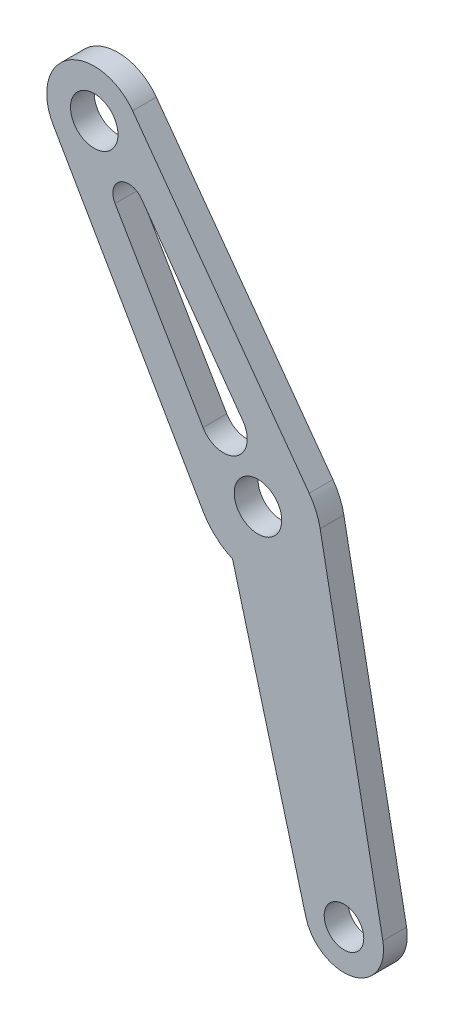
ISO-10303-21;
HEADER;
FILE_DESCRIPTION(('STEP AP214'),'2;1');
FILE_NAME('part.step','',(''),(''),'','','');
FILE_SCHEMA(('AUTOMOTIVE_DESIGN { 1 0 10303 214 1 1 1 1 }'));
ENDSEC;
DATA;
#1=APPLICATION_CONTEXT('core data for automotive mechanical design processes');
#2=APPLICATION_PROTOCOL_DEFINITION('international standard','automotive_design',2000,#1);
#3=PRODUCT_CONTEXT('',#1,'mechanical');
#4=PRODUCT('Part','Part','',(#3));
#5=PRODUCT_RELATED_PRODUCT_CATEGORY('part','',(#4));
#6=PRODUCT_DEFINITION_FORMATION('','',#4);
#7=PRODUCT_DEFINITION_CONTEXT('part definition',#1,'design');
#8=PRODUCT_DEFINITION('design','',#6,#7);
#9=PRODUCT_DEFINITION_SHAPE('','',#8);
#10=(LENGTH_UNIT() NAMED_UNIT(*) SI_UNIT(.MILLI.,.METRE.));
#11=(NAMED_UNIT(*) PLANE_ANGLE_UNIT() SI_UNIT($,.RADIAN.));
#12=(NAMED_UNIT(*) SI_UNIT($,.STERADIAN.) SOLID_ANGLE_UNIT());
#13=UNCERTAINTY_MEASURE_WITH_UNIT(LENGTH_MEASURE(1.E-05),#10,'distance_accuracy_value','');
#14=(GEOMETRIC_REPRESENTATION_CONTEXT(3) GLOBAL_UNCERTAINTY_ASSIGNED_CONTEXT((#13)) GLOBAL_UNIT_ASSIGNED_CONTEXT((#10,
#11,#12)) REPRESENTATION_CONTEXT('',''));
#15=CARTESIAN_POINT('',(0.,0.,0.));
#16=DIRECTION('',(0.,0.,1.));
#17=DIRECTION('',(1.,0.,0.));
#18=AXIS2_PLACEMENT_3D('',#15,#16,#17);
#19=CARTESIAN_POINT('',(-32.750399665372,31.391765860163,3.));
#20=DIRECTION('',(0.,0.,1.));
#21=DIRECTION('',(1.,0.,0.));
#22=AXIS2_PLACEMENT_3D('',#19,#20,#21);
#23=PLANE('',#22);
#24=CARTESIAN_POINT('',(-12.0541163348009,-0.477715721763063,3.));
#25=DIRECTION('',(0.,0.,1.));
#26=DIRECTION('',(1.,0.,0.));
#27=AXIS2_PLACEMENT_3D('',#24,#25,#26);
#28=CIRCLE('',#27,3.);
#29=CARTESIAN_POINT('',(-9.05411633480087,-0.477715721763063,3.));
#30=VERTEX_POINT('',#29);
#31=EDGE_CURVE('E164',#30,#30,#28,.T.);
#32=ORIENTED_EDGE('',*,*,#31,.F.);
#33=EDGE_LOOP('',(#32));
#34=FACE_BOUND('',#33,.T.);
#35=CARTESIAN_POINT('',(-32.750399665372,31.391765860163,3.));
#36=DIRECTION('',(0.,0.,1.));
#37=DIRECTION('',(1.,0.,0.));
#38=AXIS2_PLACEMENT_3D('',#35,#36,#37);
#39=CIRCLE('',#38,6.);
#40=CARTESIAN_POINT('',(-27.8973419266839,34.919914182578,3.));
#41=VERTEX_POINT('',#40);
#42=CARTESIAN_POINT('',(-37.9474399524906,28.3933042122399,3.));
#43=VERTEX_POINT('',#42);
#44=EDGE_CURVE('E176',#41,#43,#39,.T.);
#45=ORIENTED_EDGE('',*,*,#44,.T.);
#46=DIRECTION('',(0.499743607987195,-0.866173381186435,0.));
#47=VECTOR('',#46,1.);
#48=CARTESIAN_POINT('',(-37.9474399524906,28.3933042122399,3.));
#49=LINE('',#48,#47);
#50=CARTESIAN_POINT('',(-18.9835033842924,-4.47566458566063,3.));
#51=VERTEX_POINT('',#50);
#52=EDGE_CURVE('E179',#43,#51,#49,.T.);
#53=ORIENTED_EDGE('',*,*,#52,.T.);
#54=CARTESIAN_POINT('',(-12.0541163348009,-0.477715721763063,3.));
#55=DIRECTION('',(0.,0.,1.));
#56=DIRECTION('',(1.,0.,0.));
#57=AXIS2_PLACEMENT_3D('',#54,#55,#56);
#58=CIRCLE('',#57,8.00000000000001);
#59=CARTESIAN_POINT('',(-15.2674210476336,-7.80401579905222,3.));
#60=VERTEX_POINT('',#59);
#61=EDGE_CURVE('E182',#51,#60,#58,.T.);
#62=ORIENTED_EDGE('',*,*,#61,.T.);
#63=DIRECTION('',(0.258819045102522,-0.965925826289068,0.));
#64=VECTOR('',#63,1.);
#65=CARTESIAN_POINT('',(-15.2674210476336,-7.80401579905222,3.));
#66=LINE('',#65,#64);
#67=CARTESIAN_POINT('',(-6.0133455719403,-42.3406956514165,3.));
#68=VERTEX_POINT('',#67);
#69=EDGE_CURVE('E184',#60,#68,#66,.T.);
#70=ORIENTED_EDGE('',*,*,#69,.T.);
#71=CARTESIAN_POINT('',(-1.18371644049496,-41.0466004259039,3.));
#72=DIRECTION('',(0.,0.,1.));
#73=DIRECTION('',(1.,0.,0.));
#74=AXIS2_PLACEMENT_3D('',#71,#72,#73);
#75=CIRCLE('',#74,5.);
#76=CARTESIAN_POINT('',(3.72601182660465,-40.1007841946819,3.));
#77=VERTEX_POINT('',#76);
#78=EDGE_CURVE('E186',#68,#77,#75,.T.);
#79=ORIENTED_EDGE('',*,*,#78,.T.);
#80=DIRECTION('',(-0.1891632462444,0.981945653419923,0.));
#81=VECTOR('',#80,1.);
#82=CARTESIAN_POINT('',(3.72601182660466,-40.1007841946819,3.));
#83=LINE('',#82,#81);
#84=CARTESIAN_POINT('',(-4.19855110744148,1.03559024819214,3.));
#85=VERTEX_POINT('',#84);
#86=EDGE_CURVE('E188',#77,#85,#83,.T.);
#87=ORIENTED_EDGE('',*,*,#86,.T.);
#88=CARTESIAN_POINT('',(-12.0541163348009,-0.477715721763063,3.));
#89=DIRECTION('',(0.,0.,1.));
#90=DIRECTION('',(1.,0.,0.));
#91=AXIS2_PLACEMENT_3D('',#88,#89,#90);
#92=CIRCLE('',#91,8.);
#93=CARTESIAN_POINT('',(-5.58337268321678,4.22648204145696,3.));
#94=VERTEX_POINT('',#93);
#95=EDGE_CURVE('E190',#85,#94,#92,.T.);
#96=ORIENTED_EDGE('',*,*,#95,.T.);
#97=DIRECTION('',(-0.588024720402503,0.808842956448011,0.));
#98=VECTOR('',#97,1.);
#99=CARTESIAN_POINT('',(-27.8973419266839,34.919914182578,3.));
#100=LINE('',#99,#98);
#101=EDGE_CURVE('E192',#94,#41,#100,.T.);
#102=ORIENTED_EDGE('',*,*,#101,.T.);
#103=EDGE_LOOP('',(#45,#53,#62,#70,#79,#87,#96,#102));
#104=FACE_BOUND('',#103,.T.);
#105=CARTESIAN_POINT('',(-1.18371644049496,-41.0466004259039,3.));
#106=DIRECTION('',(0.,0.,1.));
#107=DIRECTION('',(1.,0.,0.));
#108=AXIS2_PLACEMENT_3D('',#105,#106,#107);
#109=CIRCLE('',#108,2.5);
#110=CARTESIAN_POINT('',(1.31628355950504,-41.0466004259039,3.));
#111=VERTEX_POINT('',#110);
#112=EDGE_CURVE('E170',#111,#111,#109,.T.);
#113=ORIENTED_EDGE('',*,*,#112,.F.);
#114=EDGE_LOOP('',(#113));
#115=FACE_BOUND('',#114,.T.);
#116=CARTESIAN_POINT('',(-32.750399665372,31.391765860163,3.));
#117=DIRECTION('',(0.,0.,1.));
#118=DIRECTION('',(1.,0.,0.));
#119=AXIS2_PLACEMENT_3D('',#116,#117,#118);
#120=CIRCLE('',#119,3.);
#121=CARTESIAN_POINT('',(-29.7503996653719,31.391765860163,3.));
#122=VERTEX_POINT('',#121);
#123=EDGE_CURVE('E158',#122,#122,#120,.T.);
#124=ORIENTED_EDGE('',*,*,#123,.F.);
#125=EDGE_LOOP('',(#124));
#126=FACE_BOUND('',#125,.T.);
#127=DIRECTION('',(0.505954711009421,-0.862560044522915,0.));
#128=VECTOR('',#127,1.);
#129=CARTESIAN_POINT('',(-30.1184074742976,23.6704918945808,3.));
#130=LINE('',#129,#128);
#131=CARTESIAN_POINT('',(-30.1184074742976,23.6704918945808,3.));
#132=VERTEX_POINT('',#131);
#133=CARTESIAN_POINT('',(-18.9989087484899,4.71378468877205,3.));
#134=VERTEX_POINT('',#133);
#135=EDGE_CURVE('E130',#132,#134,#130,.T.);
#136=ORIENTED_EDGE('',*,*,#135,.F.);
#137=CARTESIAN_POINT('',(-28.3932873852517,24.6824013165996,3.));
#138=DIRECTION('',(0.,0.,1.));
#139=DIRECTION('',(1.,0.,0.));
#140=AXIS2_PLACEMENT_3D('',#137,#138,#139);
#141=CIRCLE('',#140,2.);
#142=CARTESIAN_POINT('',(-26.7671925752995,25.8467962964267,3.));
#143=VERTEX_POINT('',#142);
#144=EDGE_CURVE('E122',#143,#132,#141,.T.);
#145=ORIENTED_EDGE('',*,*,#144,.F.);
#146=DIRECTION('',(-0.582197489913552,0.813047404976094,0.));
#147=VECTOR('',#146,1.);
#148=CARTESIAN_POINT('',(-26.7671925752995,25.8467962964267,3.));
#149=LINE('',#148,#147);
#150=CARTESIAN_POINT('',(-13.9720863999928,7.97824129154099,3.));
#151=VERTEX_POINT('',#150);
#152=EDGE_CURVE('E144',#151,#143,#149,.T.);
#153=ORIENTED_EDGE('',*,*,#152,.F.);
#154=CARTESIAN_POINT('',(-16.4112286149211,6.23164882180032,3.));
#155=DIRECTION('',(0.,0.,1.));
#156=DIRECTION('',(1.,0.,0.));
#157=AXIS2_PLACEMENT_3D('',#154,#155,#156);
#158=CIRCLE('',#157,3.00000000000001);
#159=EDGE_CURVE('E142',#134,#151,#158,.T.);
#160=ORIENTED_EDGE('',*,*,#159,.F.);
#161=EDGE_LOOP('',(#136,#145,#153,#160));
#162=FACE_BOUND('',#161,.T.);
#163=ADVANCED_FACE('F33',(#34,#104,#115,#126,#162),#23,.T.);
#164=CARTESIAN_POINT('',(-32.750399665372,31.391765860163,0.));
#165=DIRECTION('',(0.,0.,1.));
#166=DIRECTION('',(1.,0.,0.));
#167=AXIS2_PLACEMENT_3D('',#164,#165,#166);
#168=PLANE('',#167);
#169=CARTESIAN_POINT('',(-32.750399665372,31.391765860163,0.));
#170=DIRECTION('',(0.,0.,1.));
#171=DIRECTION('',(1.,0.,0.));
#172=AXIS2_PLACEMENT_3D('',#169,#170,#171);
#173=CIRCLE('',#172,3.);
#174=CARTESIAN_POINT('',(-29.7503996653719,31.391765860163,0.));
#175=VERTEX_POINT('',#174);
#176=EDGE_CURVE('E138',#175,#175,#173,.T.);
#177=ORIENTED_EDGE('',*,*,#176,.T.);
#178=EDGE_LOOP('',(#177));
#179=FACE_BOUND('',#178,.T.);
#180=CARTESIAN_POINT('',(-12.0541163348009,-0.477715721763063,0.));
#181=DIRECTION('',(0.,0.,1.));
#182=DIRECTION('',(1.,0.,0.));
#183=AXIS2_PLACEMENT_3D('',#180,#181,#182);
#184=CIRCLE('',#183,3.);
#185=CARTESIAN_POINT('',(-9.05411633480087,-0.477715721763063,0.));
#186=VERTEX_POINT('',#185);
#187=EDGE_CURVE('E161',#186,#186,#184,.T.);
#188=ORIENTED_EDGE('',*,*,#187,.T.);
#189=EDGE_LOOP('',(#188));
#190=FACE_BOUND('',#189,.T.);
#191=CARTESIAN_POINT('',(-1.18371644049496,-41.0466004259039,0.));
#192=DIRECTION('',(0.,0.,1.));
#193=DIRECTION('',(1.,0.,0.));
#194=AXIS2_PLACEMENT_3D('',#191,#192,#193);
#195=CIRCLE('',#194,2.5);
#196=CARTESIAN_POINT('',(1.31628355950504,-41.0466004259039,0.));
#197=VERTEX_POINT('',#196);
#198=EDGE_CURVE('E167',#197,#197,#195,.T.);
#199=ORIENTED_EDGE('',*,*,#198,.T.);
#200=EDGE_LOOP('',(#199));
#201=FACE_BOUND('',#200,.T.);
#202=CARTESIAN_POINT('',(-32.750399665372,31.391765860163,0.));
#203=DIRECTION('',(0.,0.,1.));
#204=DIRECTION('',(1.,0.,0.));
#205=AXIS2_PLACEMENT_3D('',#202,#203,#204);
#206=CIRCLE('',#205,6.);
#207=CARTESIAN_POINT('',(-27.8973419266839,34.919914182578,0.));
#208=VERTEX_POINT('',#207);
#209=CARTESIAN_POINT('',(-37.9474399524906,28.3933042122399,0.));
#210=VERTEX_POINT('',#209);
#211=EDGE_CURVE('E173',#208,#210,#206,.T.);
#212=ORIENTED_EDGE('',*,*,#211,.F.);
#213=DIRECTION('',(-0.588024720402503,0.808842956448011,0.));
#214=VECTOR('',#213,1.);
#215=CARTESIAN_POINT('',(-27.8973419266839,34.919914182578,0.));
#216=LINE('',#215,#214);
#217=CARTESIAN_POINT('',(-5.58337268321678,4.22648204145696,0.));
#218=VERTEX_POINT('',#217);
#219=EDGE_CURVE('E180',#218,#208,#216,.T.);
#220=ORIENTED_EDGE('',*,*,#219,.F.);
#221=CARTESIAN_POINT('',(-12.0541163348009,-0.477715721763063,0.));
#222=DIRECTION('',(0.,0.,1.));
#223=DIRECTION('',(1.,0.,0.));
#224=AXIS2_PLACEMENT_3D('',#221,#222,#223);
#225=CIRCLE('',#224,8.);
#226=CARTESIAN_POINT('',(-4.19855110744148,1.03559024819214,0.));
#227=VERTEX_POINT('',#226);
#228=EDGE_CURVE('E207',#227,#218,#225,.T.);
#229=ORIENTED_EDGE('',*,*,#228,.F.);
#230=DIRECTION('',(-0.1891632462444,0.981945653419923,0.));
#231=VECTOR('',#230,1.);
#232=CARTESIAN_POINT('',(3.72601182660466,-40.1007841946819,0.));
#233=LINE('',#232,#231);
#234=CARTESIAN_POINT('',(3.72601182660465,-40.1007841946819,0.));
#235=VERTEX_POINT('',#234);
#236=EDGE_CURVE('E205',#235,#227,#233,.T.);
#237=ORIENTED_EDGE('',*,*,#236,.F.);
#238=CARTESIAN_POINT('',(-1.18371644049496,-41.0466004259039,0.));
#239=DIRECTION('',(0.,0.,1.));
#240=DIRECTION('',(1.,0.,0.));
#241=AXIS2_PLACEMENT_3D('',#238,#239,#240);
#242=CIRCLE('',#241,5.);
#243=CARTESIAN_POINT('',(-6.0133455719403,-42.3406956514165,0.));
#244=VERTEX_POINT('',#243);
#245=EDGE_CURVE('E203',#244,#235,#242,.T.);
#246=ORIENTED_EDGE('',*,*,#245,.F.);
#247=DIRECTION('',(0.258819045102522,-0.965925826289068,0.));
#248=VECTOR('',#247,1.);
#249=CARTESIAN_POINT('',(-15.2674210476336,-7.80401579905222,0.));
#250=LINE('',#249,#248);
#251=CARTESIAN_POINT('',(-15.2674210476336,-7.80401579905222,0.));
#252=VERTEX_POINT('',#251);
#253=EDGE_CURVE('E201',#252,#244,#250,.T.);
#254=ORIENTED_EDGE('',*,*,#253,.F.);
#255=CARTESIAN_POINT('',(-12.0541163348009,-0.477715721763063,0.));
#256=DIRECTION('',(0.,0.,1.));
#257=DIRECTION('',(1.,0.,0.));
#258=AXIS2_PLACEMENT_3D('',#255,#256,#257);
#259=CIRCLE('',#258,8.00000000000001);
#260=CARTESIAN_POINT('',(-18.9835033842924,-4.47566458566063,0.));
#261=VERTEX_POINT('',#260);
#262=EDGE_CURVE('E199',#261,#252,#259,.T.);
#263=ORIENTED_EDGE('',*,*,#262,.F.);
#264=DIRECTION('',(0.499743607987195,-0.866173381186435,0.));
#265=VECTOR('',#264,1.);
#266=CARTESIAN_POINT('',(-37.9474399524906,28.3933042122399,0.));
#267=LINE('',#266,#265);
#268=EDGE_CURVE('E197',#210,#261,#267,.T.);
#269=ORIENTED_EDGE('',*,*,#268,.F.);
#270=EDGE_LOOP('',(#212,#220,#229,#237,#246,#254,#263,#269));
#271=FACE_BOUND('',#270,.T.);
#272=CARTESIAN_POINT('',(-28.3932873852517,24.6824013165996,0.));
#273=DIRECTION('',(0.,0.,1.));
#274=DIRECTION('',(1.,0.,0.));
#275=AXIS2_PLACEMENT_3D('',#272,#273,#274);
#276=CIRCLE('',#275,2.);
#277=CARTESIAN_POINT('',(-26.7671925752995,25.8467962964267,0.));
#278=VERTEX_POINT('',#277);
#279=CARTESIAN_POINT('',(-30.1184074742976,23.6704918945808,0.));
#280=VERTEX_POINT('',#279);
#281=EDGE_CURVE('E56',#278,#280,#276,.T.);
#282=ORIENTED_EDGE('',*,*,#281,.T.);
#283=DIRECTION('',(0.505954711009421,-0.862560044522915,0.));
#284=VECTOR('',#283,1.);
#285=CARTESIAN_POINT('',(-30.1184074742976,23.6704918945808,0.));
#286=LINE('',#285,#284);
#287=CARTESIAN_POINT('',(-18.9989087484899,4.71378468877205,0.));
#288=VERTEX_POINT('',#287);
#289=EDGE_CURVE('E137',#280,#288,#286,.T.);
#290=ORIENTED_EDGE('',*,*,#289,.T.);
#291=CARTESIAN_POINT('',(-16.4112286149211,6.23164882180032,0.));
#292=DIRECTION('',(0.,0.,1.));
#293=DIRECTION('',(1.,0.,0.));
#294=AXIS2_PLACEMENT_3D('',#291,#292,#293);
#295=CIRCLE('',#294,3.00000000000001);
#296=CARTESIAN_POINT('',(-13.9720863999928,7.97824129154099,0.));
#297=VERTEX_POINT('',#296);
#298=EDGE_CURVE('E150',#288,#297,#295,.T.);
#299=ORIENTED_EDGE('',*,*,#298,.T.);
#300=DIRECTION('',(-0.582197489913552,0.813047404976094,0.));
#301=VECTOR('',#300,1.);
#302=CARTESIAN_POINT('',(-26.7671925752995,25.8467962964267,0.));
#303=LINE('',#302,#301);
#304=EDGE_CURVE('E131',#297,#278,#303,.T.);
#305=ORIENTED_EDGE('',*,*,#304,.T.);
#306=EDGE_LOOP('',(#282,#290,#299,#305));
#307=FACE_BOUND('',#306,.T.);
#308=ADVANCED_FACE('F237',(#179,#190,#201,#271,#307),#168,.F.);
#309=CARTESIAN_POINT('',(-32.750399665372,31.391765860163,3.));
#310=DIRECTION('',(0.,0.,-1.));
#311=DIRECTION('',(-1.,0.,0.));
#312=AXIS2_PLACEMENT_3D('',#309,#310,#311);
#313=CYLINDRICAL_SURFACE('',#312,6.);
#314=ORIENTED_EDGE('',*,*,#211,.T.);
#315=DIRECTION('',(0.,0.,-1.));
#316=VECTOR('',#315,1.);
#317=CARTESIAN_POINT('',(-37.9474399524906,28.3933042122399,3.));
#318=LINE('',#317,#316);
#319=EDGE_CURVE('E11',#43,#210,#318,.T.);
#320=ORIENTED_EDGE('',*,*,#319,.F.);
#321=ORIENTED_EDGE('',*,*,#44,.F.);
#322=DIRECTION('',(0.,0.,-1.));
#323=VECTOR('',#322,1.);
#324=CARTESIAN_POINT('',(-27.8973419266839,34.919914182578,3.));
#325=LINE('',#324,#323);
#326=EDGE_CURVE('E194',#41,#208,#325,.T.);
#327=ORIENTED_EDGE('',*,*,#326,.T.);
#328=EDGE_LOOP('',(#314,#320,#321,#327));
#329=FACE_BOUND('',#328,.T.);
#330=ADVANCED_FACE('F35',(#329),#313,.T.);
#331=CARTESIAN_POINT('',(-37.9474399524906,28.3933042122399,3.));
#332=DIRECTION('',(0.866173381186435,0.499743607987195,0.));
#333=DIRECTION('',(-0.499743607987195,0.866173381186435,0.));
#334=AXIS2_PLACEMENT_3D('',#331,#332,#333);
#335=PLANE('',#334);
#336=ORIENTED_EDGE('',*,*,#268,.T.);
#337=DIRECTION('',(0.,0.,-1.));
#338=VECTOR('',#337,1.);
#339=CARTESIAN_POINT('',(-18.9835033842924,-4.47566458566063,3.));
#340=LINE('',#339,#338);
#341=EDGE_CURVE('E41',#51,#261,#340,.T.);
#342=ORIENTED_EDGE('',*,*,#341,.F.);
#343=ORIENTED_EDGE('',*,*,#52,.F.);
#344=ORIENTED_EDGE('',*,*,#319,.T.);
#345=EDGE_LOOP('',(#336,#342,#343,#344));
#346=FACE_BOUND('',#345,.T.);
#347=ADVANCED_FACE('F255',(#346),#335,.F.);
#348=CARTESIAN_POINT('',(-12.0541163348009,-0.477715721763063,3.));
#349=DIRECTION('',(0.,0.,-1.));
#350=DIRECTION('',(-1.,0.,0.));
#351=AXIS2_PLACEMENT_3D('',#348,#349,#350);
#352=CYLINDRICAL_SURFACE('',#351,8.00000000000001);
#353=ORIENTED_EDGE('',*,*,#262,.T.);
#354=DIRECTION('',(0.,0.,-1.));
#355=VECTOR('',#354,1.);
#356=CARTESIAN_POINT('',(-15.2674210476336,-7.80401579905222,3.));
#357=LINE('',#356,#355);
#358=EDGE_CURVE('E224',#60,#252,#357,.T.);
#359=ORIENTED_EDGE('',*,*,#358,.F.);
#360=ORIENTED_EDGE('',*,*,#61,.F.);
#361=ORIENTED_EDGE('',*,*,#341,.T.);
#362=EDGE_LOOP('',(#353,#359,#360,#361));
#363=FACE_BOUND('',#362,.T.);
#364=ADVANCED_FACE('F231',(#363),#352,.T.);
#365=CARTESIAN_POINT('',(-15.2674210476336,-7.80401579905222,3.));
#366=DIRECTION('',(0.965925826289068,0.258819045102522,0.));
#367=DIRECTION('',(-0.258819045102522,0.965925826289068,0.));
#368=AXIS2_PLACEMENT_3D('',#365,#366,#367);
#369=PLANE('',#368);
#370=ORIENTED_EDGE('',*,*,#253,.T.);
#371=DIRECTION('',(0.,0.,-1.));
#372=VECTOR('',#371,1.);
#373=CARTESIAN_POINT('',(-6.0133455719403,-42.3406956514165,3.));
#374=LINE('',#373,#372);
#375=EDGE_CURVE('E221',#68,#244,#374,.T.);
#376=ORIENTED_EDGE('',*,*,#375,.F.);
#377=ORIENTED_EDGE('',*,*,#69,.F.);
#378=ORIENTED_EDGE('',*,*,#358,.T.);
#379=EDGE_LOOP('',(#370,#376,#377,#378));
#380=FACE_BOUND('',#379,.T.);
#381=ADVANCED_FACE('F243',(#380),#369,.F.);
#382=CARTESIAN_POINT('',(-1.18371644049496,-41.0466004259039,3.));
#383=DIRECTION('',(0.,0.,-1.));
#384=DIRECTION('',(-1.,0.,0.));
#385=AXIS2_PLACEMENT_3D('',#382,#383,#384);
#386=CYLINDRICAL_SURFACE('',#385,5.);
#387=ORIENTED_EDGE('',*,*,#245,.T.);
#388=DIRECTION('',(0.,0.,-1.));
#389=VECTOR('',#388,1.);
#390=CARTESIAN_POINT('',(3.72601182660465,-40.1007841946819,3.));
#391=LINE('',#390,#389);
#392=EDGE_CURVE('E218',#77,#235,#391,.T.);
#393=ORIENTED_EDGE('',*,*,#392,.F.);
#394=ORIENTED_EDGE('',*,*,#78,.F.);
#395=ORIENTED_EDGE('',*,*,#375,.T.);
#396=EDGE_LOOP('',(#387,#393,#394,#395));
#397=FACE_BOUND('',#396,.T.);
#398=ADVANCED_FACE('F247',(#397),#386,.T.);
#399=CARTESIAN_POINT('',(3.72601182660466,-40.1007841946819,3.));
#400=DIRECTION('',(-0.981945653419923,-0.1891632462444,0.));
#401=DIRECTION('',(0.1891632462444,-0.981945653419923,0.));
#402=AXIS2_PLACEMENT_3D('',#399,#400,#401);
#403=PLANE('',#402);
#404=ORIENTED_EDGE('',*,*,#236,.T.);
#405=DIRECTION('',(0.,0.,-1.));
#406=VECTOR('',#405,1.);
#407=CARTESIAN_POINT('',(-4.19855110744148,1.03559024819214,3.));
#408=LINE('',#407,#406);
#409=EDGE_CURVE('E215',#85,#227,#408,.T.);
#410=ORIENTED_EDGE('',*,*,#409,.F.);
#411=ORIENTED_EDGE('',*,*,#86,.F.);
#412=ORIENTED_EDGE('',*,*,#392,.T.);
#413=EDGE_LOOP('',(#404,#410,#411,#412));
#414=FACE_BOUND('',#413,.T.);
#415=ADVANCED_FACE('F268',(#414),#403,.F.);
#416=CARTESIAN_POINT('',(-12.0541163348009,-0.477715721763063,3.));
#417=DIRECTION('',(0.,0.,-1.));
#418=DIRECTION('',(-1.,0.,0.));
#419=AXIS2_PLACEMENT_3D('',#416,#417,#418);
#420=CYLINDRICAL_SURFACE('',#419,8.);
#421=ORIENTED_EDGE('',*,*,#228,.T.);
#422=DIRECTION('',(0.,0.,-1.));
#423=VECTOR('',#422,1.);
#424=CARTESIAN_POINT('',(-5.58337268321678,4.22648204145696,3.));
#425=LINE('',#424,#423);
#426=EDGE_CURVE('E212',#94,#218,#425,.T.);
#427=ORIENTED_EDGE('',*,*,#426,.F.);
#428=ORIENTED_EDGE('',*,*,#95,.F.);
#429=ORIENTED_EDGE('',*,*,#409,.T.);
#430=EDGE_LOOP('',(#421,#427,#428,#429));
#431=FACE_BOUND('',#430,.T.);
#432=ADVANCED_FACE('F266',(#431),#420,.T.);
#433=CARTESIAN_POINT('',(-27.8973419266839,34.919914182578,3.));
#434=DIRECTION('',(-0.808842956448011,-0.588024720402503,0.));
#435=DIRECTION('',(0.588024720402503,-0.808842956448011,0.));
#436=AXIS2_PLACEMENT_3D('',#433,#434,#435);
#437=PLANE('',#436);
#438=ORIENTED_EDGE('',*,*,#219,.T.);
#439=ORIENTED_EDGE('',*,*,#326,.F.);
#440=ORIENTED_EDGE('',*,*,#101,.F.);
#441=ORIENTED_EDGE('',*,*,#426,.T.);
#442=EDGE_LOOP('',(#438,#439,#440,#441));
#443=FACE_BOUND('',#442,.T.);
#444=ADVANCED_FACE('F261',(#443),#437,.F.);
#445=CARTESIAN_POINT('',(-1.18371644049496,-41.0466004259039,3.));
#446=DIRECTION('',(0.,0.,-1.));
#447=DIRECTION('',(-1.,0.,0.));
#448=AXIS2_PLACEMENT_3D('',#445,#446,#447);
#449=CYLINDRICAL_SURFACE('',#448,2.5);
#450=ORIENTED_EDGE('',*,*,#112,.T.);
#451=EDGE_LOOP('',(#450));
#452=FACE_BOUND('',#451,.T.);
#453=ORIENTED_EDGE('',*,*,#198,.F.);
#454=EDGE_LOOP('',(#453));
#455=FACE_BOUND('',#454,.T.);
#456=ADVANCED_FACE('F287',(#452,#455),#449,.F.);
#457=CARTESIAN_POINT('',(-12.0541163348009,-0.477715721763063,3.));
#458=DIRECTION('',(0.,0.,-1.));
#459=DIRECTION('',(-1.,0.,0.));
#460=AXIS2_PLACEMENT_3D('',#457,#458,#459);
#461=CYLINDRICAL_SURFACE('',#460,3.);
#462=ORIENTED_EDGE('',*,*,#31,.T.);
#463=EDGE_LOOP('',(#462));
#464=FACE_BOUND('',#463,.T.);
#465=ORIENTED_EDGE('',*,*,#187,.F.);
#466=EDGE_LOOP('',(#465));
#467=FACE_BOUND('',#466,.T.);
#468=ADVANCED_FACE('F294',(#464,#467),#461,.F.);
#469=CARTESIAN_POINT('',(-32.750399665372,31.391765860163,3.));
#470=DIRECTION('',(0.,0.,-1.));
#471=DIRECTION('',(-1.,0.,0.));
#472=AXIS2_PLACEMENT_3D('',#469,#470,#471);
#473=CYLINDRICAL_SURFACE('',#472,3.);
#474=ORIENTED_EDGE('',*,*,#123,.T.);
#475=EDGE_LOOP('',(#474));
#476=FACE_BOUND('',#475,.T.);
#477=ORIENTED_EDGE('',*,*,#176,.F.);
#478=EDGE_LOOP('',(#477));
#479=FACE_BOUND('',#478,.T.);
#480=ADVANCED_FACE('F299',(#476,#479),#473,.F.);
#481=CARTESIAN_POINT('',(-28.3932873852517,24.6824013165996,3.));
#482=DIRECTION('',(0.,0.,-1.));
#483=DIRECTION('',(-1.,0.,0.));
#484=AXIS2_PLACEMENT_3D('',#481,#482,#483);
#485=CYLINDRICAL_SURFACE('',#484,2.);
#486=ORIENTED_EDGE('',*,*,#281,.F.);
#487=DIRECTION('',(0.,0.,-1.));
#488=VECTOR('',#487,1.);
#489=CARTESIAN_POINT('',(-26.7671925752995,25.8467962964267,3.));
#490=LINE('',#489,#488);
#491=EDGE_CURVE('E126',#143,#278,#490,.T.);
#492=ORIENTED_EDGE('',*,*,#491,.F.);
#493=ORIENTED_EDGE('',*,*,#144,.T.);
#494=DIRECTION('',(0.,0.,-1.));
#495=VECTOR('',#494,1.);
#496=CARTESIAN_POINT('',(-30.1184074742976,23.6704918945808,3.));
#497=LINE('',#496,#495);
#498=EDGE_CURVE('E125',#132,#280,#497,.T.);
#499=ORIENTED_EDGE('',*,*,#498,.T.);
#500=EDGE_LOOP('',(#486,#492,#493,#499));
#501=FACE_BOUND('',#500,.T.);
#502=ADVANCED_FACE('F124',(#501),#485,.F.);
#503=CARTESIAN_POINT('',(-30.1184074742976,23.6704918945808,3.));
#504=DIRECTION('',(0.862560044522915,0.505954711009421,0.));
#505=DIRECTION('',(-0.505954711009421,0.862560044522915,0.));
#506=AXIS2_PLACEMENT_3D('',#503,#504,#505);
#507=PLANE('',#506);
#508=ORIENTED_EDGE('',*,*,#289,.F.);
#509=ORIENTED_EDGE('',*,*,#498,.F.);
#510=ORIENTED_EDGE('',*,*,#135,.T.);
#511=DIRECTION('',(0.,0.,-1.));
#512=VECTOR('',#511,1.);
#513=CARTESIAN_POINT('',(-18.9989087484899,4.71378468877205,3.));
#514=LINE('',#513,#512);
#515=EDGE_CURVE('E139',#134,#288,#514,.T.);
#516=ORIENTED_EDGE('',*,*,#515,.T.);
#517=EDGE_LOOP('',(#508,#509,#510,#516));
#518=FACE_BOUND('',#517,.T.);
#519=ADVANCED_FACE('F134',(#518),#507,.T.);
#520=CARTESIAN_POINT('',(-16.4112286149211,6.23164882180032,3.));
#521=DIRECTION('',(0.,0.,-1.));
#522=DIRECTION('',(-1.,0.,0.));
#523=AXIS2_PLACEMENT_3D('',#520,#521,#522);
#524=CYLINDRICAL_SURFACE('',#523,3.00000000000001);
#525=ORIENTED_EDGE('',*,*,#298,.F.);
#526=ORIENTED_EDGE('',*,*,#515,.F.);
#527=ORIENTED_EDGE('',*,*,#159,.T.);
#528=DIRECTION('',(0.,0.,-1.));
#529=VECTOR('',#528,1.);
#530=CARTESIAN_POINT('',(-13.9720863999928,7.97824129154099,3.));
#531=LINE('',#530,#529);
#532=EDGE_CURVE('E48',#151,#297,#531,.T.);
#533=ORIENTED_EDGE('',*,*,#532,.T.);
#534=EDGE_LOOP('',(#525,#526,#527,#533));
#535=FACE_BOUND('',#534,.T.);
#536=ADVANCED_FACE('F322',(#535),#524,.F.);
#537=CARTESIAN_POINT('',(-26.7671925752995,25.8467962964267,3.));
#538=DIRECTION('',(-0.813047404976094,-0.582197489913552,0.));
#539=DIRECTION('',(0.582197489913552,-0.813047404976094,0.));
#540=AXIS2_PLACEMENT_3D('',#537,#538,#539);
#541=PLANE('',#540);
#542=ORIENTED_EDGE('',*,*,#304,.F.);
#543=ORIENTED_EDGE('',*,*,#532,.F.);
#544=ORIENTED_EDGE('',*,*,#152,.T.);
#545=ORIENTED_EDGE('',*,*,#491,.T.);
#546=EDGE_LOOP('',(#542,#543,#544,#545));
#547=FACE_BOUND('',#546,.T.);
#548=ADVANCED_FACE('F325',(#547),#541,.T.);
#549=CLOSED_SHELL('',(#163,#308,#330,#347,#364,#381,#398,#415,#432,#444,#456,#468,#480,#502,
#519,#536,#548));
#550=MANIFOLD_SOLID_BREP('B2',#549);
#551=ADVANCED_BREP_SHAPE_REPRESENTATION('',(#18,#550),#14);
#552=SHAPE_DEFINITION_REPRESENTATION(#9,#551);
ENDSEC;
END-ISO-10303-21;
